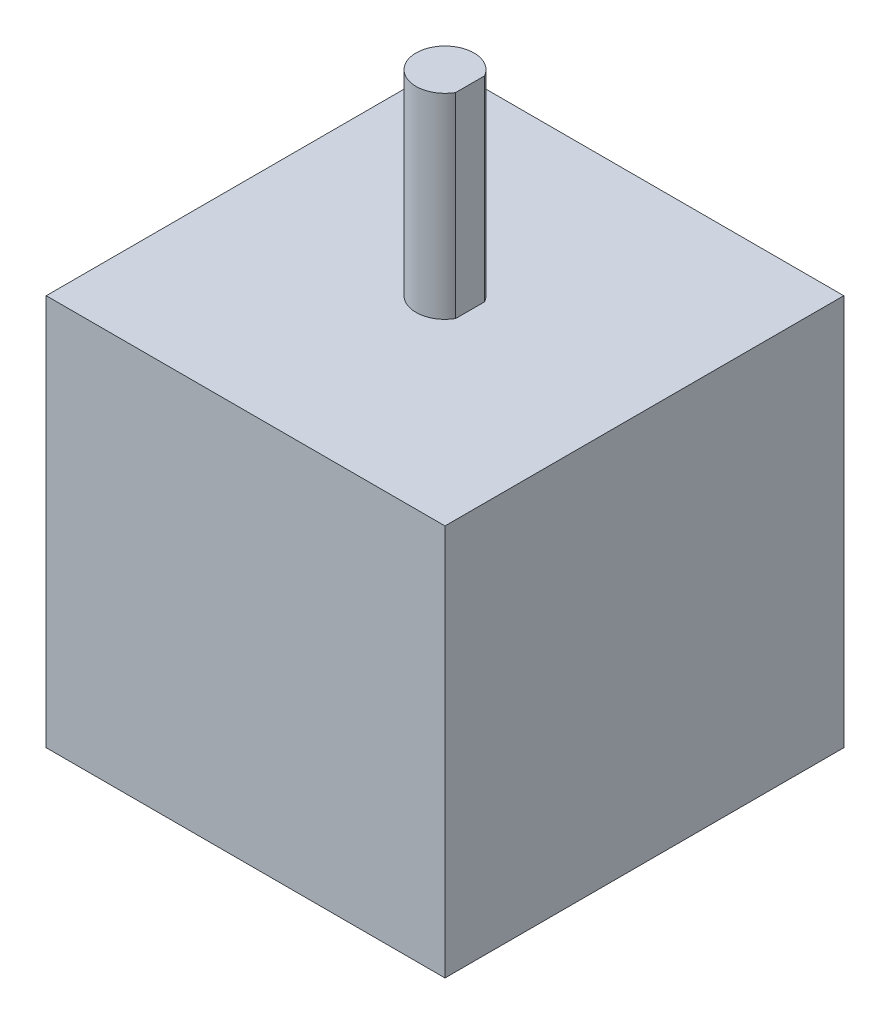
ISO-10303-21;
HEADER;
FILE_DESCRIPTION(('STEP AP214'),'2;1');
FILE_NAME('part.step','',(''),(''),'','','');
FILE_SCHEMA(('AUTOMOTIVE_DESIGN { 1 0 10303 214 1 1 1 1 }'));
ENDSEC;
DATA;
#1=APPLICATION_CONTEXT('core data for automotive mechanical design processes');
#2=APPLICATION_PROTOCOL_DEFINITION('international standard','automotive_design',2000,#1);
#3=PRODUCT_CONTEXT('',#1,'mechanical');
#4=PRODUCT('Part','Part','',(#3));
#5=PRODUCT_RELATED_PRODUCT_CATEGORY('part','',(#4));
#6=PRODUCT_DEFINITION_FORMATION('','',#4);
#7=PRODUCT_DEFINITION_CONTEXT('part definition',#1,'design');
#8=PRODUCT_DEFINITION('design','',#6,#7);
#9=PRODUCT_DEFINITION_SHAPE('','',#8);
#10=(LENGTH_UNIT() NAMED_UNIT(*) SI_UNIT(.MILLI.,.METRE.));
#11=(NAMED_UNIT(*) PLANE_ANGLE_UNIT() SI_UNIT($,.RADIAN.));
#12=(NAMED_UNIT(*) SI_UNIT($,.STERADIAN.) SOLID_ANGLE_UNIT());
#13=UNCERTAINTY_MEASURE_WITH_UNIT(LENGTH_MEASURE(1.E-05),#10,'distance_accuracy_value','');
#14=(GEOMETRIC_REPRESENTATION_CONTEXT(3) GLOBAL_UNCERTAINTY_ASSIGNED_CONTEXT((#13)) GLOBAL_UNIT_ASSIGNED_CONTEXT((#10,
#11,#12)) REPRESENTATION_CONTEXT('',''));
#15=CARTESIAN_POINT('',(0.,0.,0.));
#16=DIRECTION('',(0.,0.,1.));
#17=DIRECTION('',(1.,0.,0.));
#18=AXIS2_PLACEMENT_3D('',#15,#16,#17);
#19=CARTESIAN_POINT('',(27.5,54.,27.5));
#20=DIRECTION('',(-1.,0.,0.));
#21=DIRECTION('',(0.,0.,1.));
#22=AXIS2_PLACEMENT_3D('',#19,#20,#21);
#23=PLANE('',#22);
#24=DIRECTION('',(0.,0.,-1.));
#25=VECTOR('',#24,1.);
#26=CARTESIAN_POINT('',(27.5,0.,27.5));
#27=LINE('',#26,#25);
#28=CARTESIAN_POINT('',(27.5,0.,27.5));
#29=VERTEX_POINT('',#28);
#30=CARTESIAN_POINT('',(27.5,0.,-27.5));
#31=VERTEX_POINT('',#30);
#32=EDGE_CURVE('E133',#29,#31,#27,.T.);
#33=ORIENTED_EDGE('',*,*,#32,.T.);
#34=DIRECTION('',(0.,-1.,0.));
#35=VECTOR('',#34,1.);
#36=CARTESIAN_POINT('',(27.5,54.,-27.5));
#37=LINE('',#36,#35);
#38=CARTESIAN_POINT('',(27.5,54.,-27.5));
#39=VERTEX_POINT('',#38);
#40=EDGE_CURVE('E51',#39,#31,#37,.T.);
#41=ORIENTED_EDGE('',*,*,#40,.F.);
#42=DIRECTION('',(0.,0.,-1.));
#43=VECTOR('',#42,1.);
#44=CARTESIAN_POINT('',(27.5,54.,27.5));
#45=LINE('',#44,#43);
#46=CARTESIAN_POINT('',(27.5,54.,27.5));
#47=VERTEX_POINT('',#46);
#48=EDGE_CURVE('E126',#47,#39,#45,.T.);
#49=ORIENTED_EDGE('',*,*,#48,.F.);
#50=DIRECTION('',(0.,-1.,0.));
#51=VECTOR('',#50,1.);
#52=CARTESIAN_POINT('',(27.5,54.,27.5));
#53=LINE('',#52,#51);
#54=EDGE_CURVE('E143',#47,#29,#53,.T.);
#55=ORIENTED_EDGE('',*,*,#54,.T.);
#56=EDGE_LOOP('',(#33,#41,#49,#55));
#57=FACE_BOUND('',#56,.T.);
#58=ADVANCED_FACE('F43',(#57),#23,.F.);
#59=CARTESIAN_POINT('',(-27.5,54.,-27.5));
#60=DIRECTION('',(0.,0.,1.));
#61=DIRECTION('',(1.,0.,0.));
#62=AXIS2_PLACEMENT_3D('',#59,#60,#61);
#63=PLANE('',#62);
#64=DIRECTION('',(-1.,0.,0.));
#65=VECTOR('',#64,1.);
#66=CARTESIAN_POINT('',(-27.5,0.,-27.5));
#67=LINE('',#66,#65);
#68=CARTESIAN_POINT('',(-27.5,0.,-27.5));
#69=VERTEX_POINT('',#68);
#70=EDGE_CURVE('E151',#31,#69,#67,.T.);
#71=ORIENTED_EDGE('',*,*,#70,.T.);
#72=DIRECTION('',(0.,-1.,0.));
#73=VECTOR('',#72,1.);
#74=CARTESIAN_POINT('',(-27.5,54.,-27.5));
#75=LINE('',#74,#73);
#76=CARTESIAN_POINT('',(-27.5,54.,-27.5));
#77=VERTEX_POINT('',#76);
#78=EDGE_CURVE('E135',#77,#69,#75,.T.);
#79=ORIENTED_EDGE('',*,*,#78,.F.);
#80=DIRECTION('',(-1.,0.,0.));
#81=VECTOR('',#80,1.);
#82=CARTESIAN_POINT('',(-27.5,54.,-27.5));
#83=LINE('',#82,#81);
#84=EDGE_CURVE('E96',#39,#77,#83,.T.);
#85=ORIENTED_EDGE('',*,*,#84,.F.);
#86=ORIENTED_EDGE('',*,*,#40,.T.);
#87=EDGE_LOOP('',(#71,#79,#85,#86));
#88=FACE_BOUND('',#87,.T.);
#89=ADVANCED_FACE('F179',(#88),#63,.F.);
#90=CARTESIAN_POINT('',(-27.5,54.,27.5));
#91=DIRECTION('',(1.,0.,0.));
#92=DIRECTION('',(0.,0.,-1.));
#93=AXIS2_PLACEMENT_3D('',#90,#91,#92);
#94=PLANE('',#93);
#95=DIRECTION('',(0.,0.,1.));
#96=VECTOR('',#95,1.);
#97=CARTESIAN_POINT('',(-27.5,0.,27.5));
#98=LINE('',#97,#96);
#99=CARTESIAN_POINT('',(-27.5,0.,27.5));
#100=VERTEX_POINT('',#99);
#101=EDGE_CURVE('E148',#69,#100,#98,.T.);
#102=ORIENTED_EDGE('',*,*,#101,.T.);
#103=DIRECTION('',(0.,-1.,0.));
#104=VECTOR('',#103,1.);
#105=CARTESIAN_POINT('',(-27.5,54.,27.5));
#106=LINE('',#105,#104);
#107=CARTESIAN_POINT('',(-27.5,54.,27.5));
#108=VERTEX_POINT('',#107);
#109=EDGE_CURVE('E138',#108,#100,#106,.T.);
#110=ORIENTED_EDGE('',*,*,#109,.F.);
#111=DIRECTION('',(0.,0.,1.));
#112=VECTOR('',#111,1.);
#113=CARTESIAN_POINT('',(-27.5,54.,27.5));
#114=LINE('',#113,#112);
#115=EDGE_CURVE('E158',#77,#108,#114,.T.);
#116=ORIENTED_EDGE('',*,*,#115,.F.);
#117=ORIENTED_EDGE('',*,*,#78,.T.);
#118=EDGE_LOOP('',(#102,#110,#116,#117));
#119=FACE_BOUND('',#118,.T.);
#120=ADVANCED_FACE('F183',(#119),#94,.F.);
#121=CARTESIAN_POINT('',(-27.5,54.,27.5));
#122=DIRECTION('',(0.,0.,-1.));
#123=DIRECTION('',(-1.,0.,0.));
#124=AXIS2_PLACEMENT_3D('',#121,#122,#123);
#125=PLANE('',#124);
#126=DIRECTION('',(1.,0.,0.));
#127=VECTOR('',#126,1.);
#128=CARTESIAN_POINT('',(-27.5,0.,27.5));
#129=LINE('',#128,#127);
#130=EDGE_CURVE('E88',#100,#29,#129,.T.);
#131=ORIENTED_EDGE('',*,*,#130,.T.);
#132=ORIENTED_EDGE('',*,*,#54,.F.);
#133=DIRECTION('',(1.,0.,0.));
#134=VECTOR('',#133,1.);
#135=CARTESIAN_POINT('',(-27.5,54.,27.5));
#136=LINE('',#135,#134);
#137=EDGE_CURVE('E67',#108,#47,#136,.T.);
#138=ORIENTED_EDGE('',*,*,#137,.F.);
#139=ORIENTED_EDGE('',*,*,#109,.T.);
#140=EDGE_LOOP('',(#131,#132,#138,#139));
#141=FACE_BOUND('',#140,.T.);
#142=ADVANCED_FACE('F123',(#141),#125,.F.);
#143=CARTESIAN_POINT('',(0.,54.,0.));
#144=DIRECTION('',(0.,-1.,0.));
#145=DIRECTION('',(0.,0.,-1.));
#146=AXIS2_PLACEMENT_3D('',#143,#144,#145);
#147=PLANE('',#146);
#148=CARTESIAN_POINT('',(0.,54.,0.));
#149=DIRECTION('',(0.,-1.,0.));
#150=DIRECTION('',(0.,0.,-1.));
#151=AXIS2_PLACEMENT_3D('',#148,#149,#150);
#152=CIRCLE('',#151,4.);
#153=CARTESIAN_POINT('',(3.46410161513775,54.,-2.));
#154=VERTEX_POINT('',#153);
#155=CARTESIAN_POINT('',(3.46410161513775,54.,2.));
#156=VERTEX_POINT('',#155);
#157=EDGE_CURVE('E11',#154,#156,#152,.F.);
#158=ORIENTED_EDGE('',*,*,#157,.F.);
#159=DIRECTION('',(0.,0.,1.));
#160=VECTOR('',#159,1.);
#161=CARTESIAN_POINT('',(3.46410161513775,54.,-2.));
#162=LINE('',#161,#160);
#163=EDGE_CURVE('E104',#154,#156,#162,.T.);
#164=ORIENTED_EDGE('',*,*,#163,.T.);
#165=EDGE_LOOP('',(#158,#164));
#166=FACE_BOUND('',#165,.T.);
#167=ORIENTED_EDGE('',*,*,#48,.T.);
#168=ORIENTED_EDGE('',*,*,#84,.T.);
#169=ORIENTED_EDGE('',*,*,#115,.T.);
#170=ORIENTED_EDGE('',*,*,#137,.T.);
#171=EDGE_LOOP('',(#167,#168,#169,#170));
#172=FACE_BOUND('',#171,.T.);
#173=ADVANCED_FACE('F120',(#166,#172),#147,.F.);
#174=CARTESIAN_POINT('',(0.,0.,0.));
#175=DIRECTION('',(0.,-1.,0.));
#176=DIRECTION('',(0.,0.,-1.));
#177=AXIS2_PLACEMENT_3D('',#174,#175,#176);
#178=PLANE('',#177);
#179=ORIENTED_EDGE('',*,*,#32,.F.);
#180=ORIENTED_EDGE('',*,*,#130,.F.);
#181=ORIENTED_EDGE('',*,*,#101,.F.);
#182=ORIENTED_EDGE('',*,*,#70,.F.);
#183=EDGE_LOOP('',(#179,#180,#181,#182));
#184=FACE_BOUND('',#183,.T.);
#185=ADVANCED_FACE('F122',(#184),#178,.T.);
#186=CARTESIAN_POINT('',(0.,81.,0.));
#187=DIRECTION('',(0.,-1.,0.));
#188=DIRECTION('',(0.,0.,-1.));
#189=AXIS2_PLACEMENT_3D('',#186,#187,#188);
#190=CYLINDRICAL_SURFACE('',#189,4.);
#191=CARTESIAN_POINT('',(0.,81.,0.));
#192=DIRECTION('',(0.,1.,0.));
#193=DIRECTION('',(0.,0.,1.));
#194=AXIS2_PLACEMENT_3D('',#191,#192,#193);
#195=CIRCLE('',#194,4.);
#196=CARTESIAN_POINT('',(3.46410161513775,81.,-2.));
#197=VERTEX_POINT('',#196);
#198=CARTESIAN_POINT('',(3.46410161513775,81.,2.));
#199=VERTEX_POINT('',#198);
#200=EDGE_CURVE('E117',#197,#199,#195,.T.);
#201=ORIENTED_EDGE('',*,*,#200,.F.);
#202=DIRECTION('',(0.,1.,0.));
#203=VECTOR('',#202,1.);
#204=CARTESIAN_POINT('',(3.46410161513775,54.,-2.));
#205=LINE('',#204,#203);
#206=EDGE_CURVE('E58',#154,#197,#205,.T.);
#207=ORIENTED_EDGE('',*,*,#206,.F.);
#208=ORIENTED_EDGE('',*,*,#157,.T.);
#209=DIRECTION('',(0.,1.,0.));
#210=VECTOR('',#209,1.);
#211=CARTESIAN_POINT('',(3.46410161513775,54.,2.));
#212=LINE('',#211,#210);
#213=EDGE_CURVE('E107',#156,#199,#212,.T.);
#214=ORIENTED_EDGE('',*,*,#213,.T.);
#215=EDGE_LOOP('',(#201,#207,#208,#214));
#216=FACE_BOUND('',#215,.T.);
#217=ADVANCED_FACE('F115',(#216),#190,.T.);
#218=CARTESIAN_POINT('',(0.,81.,0.));
#219=DIRECTION('',(0.,1.,0.));
#220=DIRECTION('',(0.,0.,1.));
#221=AXIS2_PLACEMENT_3D('',#218,#219,#220);
#222=PLANE('',#221);
#223=DIRECTION('',(0.,0.,1.));
#224=VECTOR('',#223,1.);
#225=CARTESIAN_POINT('',(3.46410161513775,81.,-2.));
#226=LINE('',#225,#224);
#227=EDGE_CURVE('E111',#197,#199,#226,.T.);
#228=ORIENTED_EDGE('',*,*,#227,.F.);
#229=ORIENTED_EDGE('',*,*,#200,.T.);
#230=EDGE_LOOP('',(#228,#229));
#231=FACE_BOUND('',#230,.T.);
#232=ADVANCED_FACE('F169',(#231),#222,.T.);
#233=CARTESIAN_POINT('',(3.46410161513775,54.,-2.));
#234=DIRECTION('',(-1.,0.,0.));
#235=DIRECTION('',(0.,0.,1.));
#236=AXIS2_PLACEMENT_3D('',#233,#234,#235);
#237=PLANE('',#236);
#238=ORIENTED_EDGE('',*,*,#227,.T.);
#239=ORIENTED_EDGE('',*,*,#213,.F.);
#240=ORIENTED_EDGE('',*,*,#163,.F.);
#241=ORIENTED_EDGE('',*,*,#206,.T.);
#242=EDGE_LOOP('',(#238,#239,#240,#241));
#243=FACE_BOUND('',#242,.T.);
#244=ADVANCED_FACE('F105',(#243),#237,.F.);
#245=CLOSED_SHELL('',(#58,#89,#120,#142,#173,#185,#217,#232,#244));
#246=MANIFOLD_SOLID_BREP('B2',#245);
#247=ADVANCED_BREP_SHAPE_REPRESENTATION('',(#18,#246),#14);
#248=SHAPE_DEFINITION_REPRESENTATION(#9,#247);
ENDSEC;
END-ISO-10303-21;
